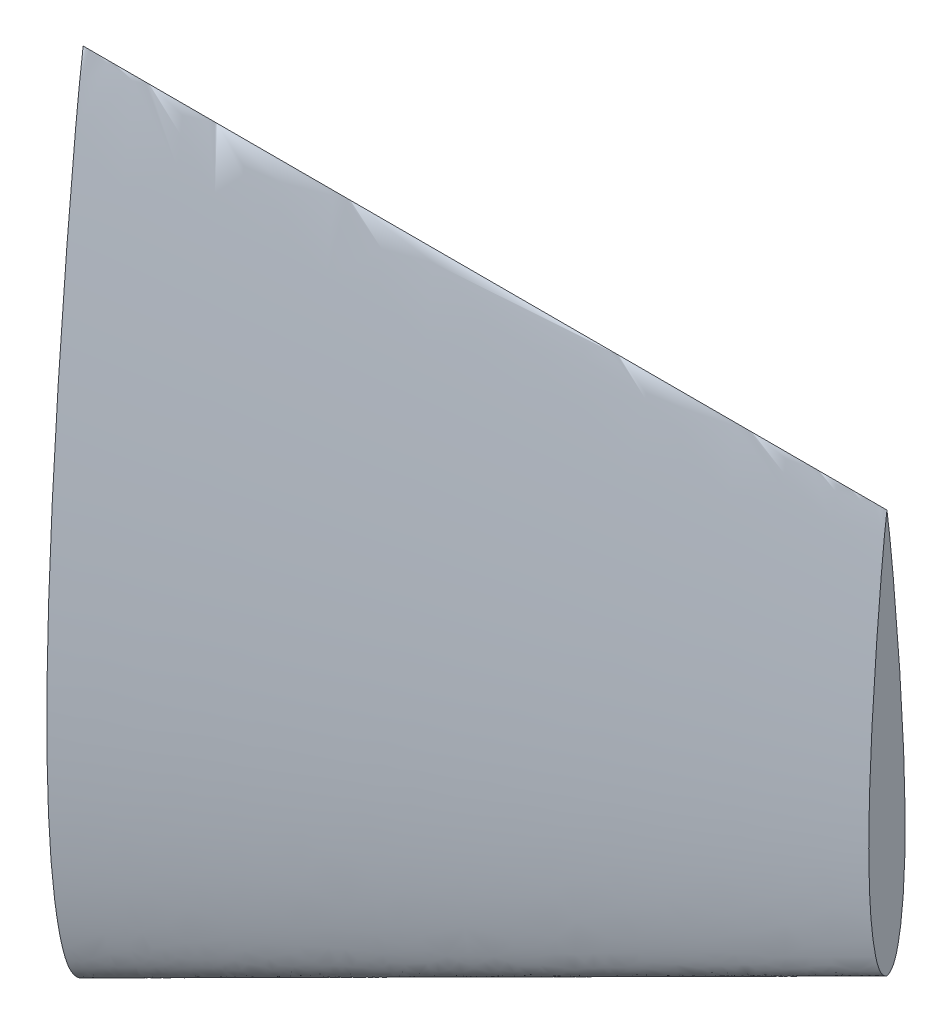
ISO-10303-21;
HEADER;
FILE_DESCRIPTION(('STEP AP214'),'2;1');
FILE_NAME('part.step','',(''),(''),'','','');
FILE_SCHEMA(('AUTOMOTIVE_DESIGN { 1 0 10303 214 1 1 1 1 }'));
ENDSEC;
DATA;
#1=APPLICATION_CONTEXT('core data for automotive mechanical design processes');
#2=APPLICATION_PROTOCOL_DEFINITION('international standard','automotive_design',2000,#1);
#3=PRODUCT_CONTEXT('',#1,'mechanical');
#4=PRODUCT('Part','Part','',(#3));
#5=PRODUCT_RELATED_PRODUCT_CATEGORY('part','',(#4));
#6=PRODUCT_DEFINITION_FORMATION('','',#4);
#7=PRODUCT_DEFINITION_CONTEXT('part definition',#1,'design');
#8=PRODUCT_DEFINITION('design','',#6,#7);
#9=PRODUCT_DEFINITION_SHAPE('','',#8);
#10=(LENGTH_UNIT() NAMED_UNIT(*) SI_UNIT(.MILLI.,.METRE.));
#11=(NAMED_UNIT(*) PLANE_ANGLE_UNIT() SI_UNIT($,.RADIAN.));
#12=(NAMED_UNIT(*) SI_UNIT($,.STERADIAN.) SOLID_ANGLE_UNIT());
#13=UNCERTAINTY_MEASURE_WITH_UNIT(LENGTH_MEASURE(1.E-05),#10,'distance_accuracy_value','');
#14=(GEOMETRIC_REPRESENTATION_CONTEXT(3) GLOBAL_UNCERTAINTY_ASSIGNED_CONTEXT((#13)) GLOBAL_UNIT_ASSIGNED_CONTEXT((#10,
#11,#12)) REPRESENTATION_CONTEXT('',''));
#15=CARTESIAN_POINT('',(0.,0.,0.));
#16=DIRECTION('',(0.,0.,1.));
#17=DIRECTION('',(1.,0.,0.));
#18=AXIS2_PLACEMENT_3D('',#15,#16,#17);
#19=CARTESIAN_POINT('',(57.,114.4,0.));
#20=CARTESIAN_POINT('',(0.,114.4,0.));
#21=CARTESIAN_POINT('',(57.,114.4,-0.00182095810749763));
#22=CARTESIAN_POINT('',(0.,114.4,-0.00364191621499526));
#23=CARTESIAN_POINT('',(57.,114.352907672617,-0.00546220916385912));
#24=CARTESIAN_POINT('',(0.,114.305815345234,-0.0109244183277182));
#25=CARTESIAN_POINT('',(57.,114.32002966172,-0.0109070616915182));
#26=CARTESIAN_POINT('',(0.,114.240059323441,-0.0218141233830365));
#27=CARTESIAN_POINT('',(57.,114.249222738711,-0.0198785714299646));
#28=CARTESIAN_POINT('',(0.,114.098445477423,-0.0397571428599293));
#29=CARTESIAN_POINT('',(57.,114.156548337744,-0.032132456041945));
#30=CARTESIAN_POINT('',(0.,113.913096675488,-0.0642649120838899));
#31=CARTESIAN_POINT('',(57.,114.034213823481,-0.0474417351200506));
#32=CARTESIAN_POINT('',(0.,113.668427646962,-0.0948834702401012));
#33=CARTESIAN_POINT('',(57.,113.886541749933,-0.0656072474393022));
#34=CARTESIAN_POINT('',(0.,113.373083499866,-0.131214494878604));
#35=CARTESIAN_POINT('',(57.,113.370012426993,-0.127548617429597));
#36=CARTESIAN_POINT('',(0.,112.340024853985,-0.255097234859193));
#37=CARTESIAN_POINT('',(57.,112.137163028017,-0.259027461460315));
#38=CARTESIAN_POINT('',(0.,109.874326056035,-0.51805492292063));
#39=CARTESIAN_POINT('',(57.,110.501004902275,-0.411740073326686));
#40=CARTESIAN_POINT('',(0.,106.60200980455,-0.823480146653373));
#41=CARTESIAN_POINT('',(57.,108.197187000479,-0.60964155845022));
#42=CARTESIAN_POINT('',(0.,101.994374000957,-1.21928311690044));
#43=CARTESIAN_POINT('',(57.,105.44956023543,-0.82314706743673));
#44=CARTESIAN_POINT('',(0.,96.4991204708607,-1.64629413487346));
#45=CARTESIAN_POINT('',(57.,101.925918142368,-1.05329602538316));
#46=CARTESIAN_POINT('',(0.,89.4518362847364,-2.10659205076633));
#47=CARTESIAN_POINT('',(57.0000000000001,98.2774944583724,-1.22854383866665));
#48=CARTESIAN_POINT('',(0.,82.1549889167448,-2.45708767733329));
#49=CARTESIAN_POINT('',(57.,95.5458702597783,-1.29200246249632));
#50=CARTESIAN_POINT('',(0.,76.6917405195566,-2.58400492499264));
#51=CARTESIAN_POINT('',(57.,93.7843198333664,-1.28990739427786));
#52=CARTESIAN_POINT('',(0.,73.1686396667328,-2.57981478855572));
#53=CARTESIAN_POINT('',(57.,92.7064529548784,-1.27556105945408));
#54=CARTESIAN_POINT('',(0.,71.0129059097568,-2.55112211890817));
#55=CARTESIAN_POINT('',(57.,91.4434168803456,-1.23757411909588));
#56=CARTESIAN_POINT('',(0.,68.4868337606911,-2.47514823819176));
#57=CARTESIAN_POINT('',(57.,89.8610871222189,-1.14403607707087));
#58=CARTESIAN_POINT('',(0.,65.3221742444376,-2.28807215414174));
#59=CARTESIAN_POINT('',(56.9999999999999,88.6339594379661,-1.01587816182833));
#60=CARTESIAN_POINT('',(0.,62.8679188759322,-2.03175632365666));
#61=CARTESIAN_POINT('',(57.,87.7322213407688,-0.870007471666012));
#62=CARTESIAN_POINT('',(0.,61.0644426815377,-1.74001494333202));
#63=CARTESIAN_POINT('',(57.,87.291174629283,-0.784346378199465));
#64=CARTESIAN_POINT('',(0.,60.1823492585658,-1.56869275639893));
#65=CARTESIAN_POINT('',(57.,86.9042703456185,-0.693141039222563));
#66=CARTESIAN_POINT('',(0.,59.4085406912369,-1.38628207844513));
#67=CARTESIAN_POINT('',(57.,86.5733208454091,-0.59333455424871));
#68=CARTESIAN_POINT('',(0.,58.746641690818,-1.18666910849742));
#69=CARTESIAN_POINT('',(57.,86.2785415535032,-0.4748173297146));
#70=CARTESIAN_POINT('',(0.,58.1570831070064,-0.9496346594292));
#71=CARTESIAN_POINT('',(57.,86.0648861911922,-0.349405025256917));
#72=CARTESIAN_POINT('',(0.,57.7297723823844,-0.698810050513834));
#73=CARTESIAN_POINT('',(57.,85.9154971726472,-0.217553009946631));
#74=CARTESIAN_POINT('',(0.,57.4309943452943,-0.435106019893263));
#75=CARTESIAN_POINT('',(57.,85.8398706402099,-0.125468872465283));
#76=CARTESIAN_POINT('',(0.,57.2797412804197,-0.250937744930566));
#77=CARTESIAN_POINT('',(57.,85.8046969145248,-0.0466468105661051));
#78=CARTESIAN_POINT('',(0.,57.2093938290495,-0.0932936211322103));
#79=CARTESIAN_POINT('',(57.,85.7984647875065,0.));
#80=CARTESIAN_POINT('',(0.,57.196929575013,0.));
#81=CARTESIAN_POINT('',(57.,85.8046969145248,0.0466468105660989));
#82=CARTESIAN_POINT('',(0.,57.2093938290495,0.0932936211321978));
#83=CARTESIAN_POINT('',(57.,85.8398706402099,0.125468872465298));
#84=CARTESIAN_POINT('',(0.,57.2797412804197,0.250937744930596));
#85=CARTESIAN_POINT('',(57.,85.9154971726472,0.217553009946615));
#86=CARTESIAN_POINT('',(0.,57.4309943452942,0.43510601989323));
#87=CARTESIAN_POINT('',(57.,86.0648861911922,0.349405025256929));
#88=CARTESIAN_POINT('',(0.,57.7297723823844,0.698810050513857));
#89=CARTESIAN_POINT('',(57.,86.2785415535032,0.474817329714599));
#90=CARTESIAN_POINT('',(0.,58.1570831070064,0.949634659429199));
#91=CARTESIAN_POINT('',(57.,86.5733208454091,0.593334554248706));
#92=CARTESIAN_POINT('',(0.,58.746641690818,1.18666910849741));
#93=CARTESIAN_POINT('',(57.,86.9042703456185,0.693141039222563));
#94=CARTESIAN_POINT('',(0.,59.4085406912369,1.38628207844513));
#95=CARTESIAN_POINT('',(57.,87.2911746292829,0.784346378199468));
#96=CARTESIAN_POINT('',(0.,60.1823492585659,1.56869275639894));
#97=CARTESIAN_POINT('',(57.,87.7322213407688,0.870007471666016));
#98=CARTESIAN_POINT('',(0.,61.0644426815377,1.74001494333203));
#99=CARTESIAN_POINT('',(57.,88.6339594379661,1.01587816182832));
#100=CARTESIAN_POINT('',(0.,62.867918875932,2.03175632365664));
#101=CARTESIAN_POINT('',(57.,89.8610871222189,1.14403607707087));
#102=CARTESIAN_POINT('',(0.,65.3221742444377,2.28807215414174));
#103=CARTESIAN_POINT('',(57.,91.4434168803456,1.23757411909588));
#104=CARTESIAN_POINT('',(0.,68.4868337606911,2.47514823819176));
#105=CARTESIAN_POINT('',(57.,92.7064529548784,1.27556105945408));
#106=CARTESIAN_POINT('',(0.,71.0129059097568,2.55112211890816));
#107=CARTESIAN_POINT('',(57.,93.7843198333664,1.28990739427786));
#108=CARTESIAN_POINT('',(0.,73.1686396667329,2.57981478855573));
#109=CARTESIAN_POINT('',(57.,95.5458702597782,1.29200246249631));
#110=CARTESIAN_POINT('',(0.,76.6917405195565,2.58400492499263));
#111=CARTESIAN_POINT('',(57.,98.2774944583724,1.22854383866664));
#112=CARTESIAN_POINT('',(0.,82.1549889167447,2.45708767733329));
#113=CARTESIAN_POINT('',(57.,101.925918142368,1.05329602538317));
#114=CARTESIAN_POINT('',(0.,89.4518362847363,2.10659205076633));
#115=CARTESIAN_POINT('',(57.,105.44956023543,0.823147067436728));
#116=CARTESIAN_POINT('',(0.,96.4991204708606,1.64629413487346));
#117=CARTESIAN_POINT('',(57.,108.197187000479,0.609641558450223));
#118=CARTESIAN_POINT('',(0.,101.994374000957,1.21928311690045));
#119=CARTESIAN_POINT('',(57.,110.501004902275,0.411740073326685));
#120=CARTESIAN_POINT('',(0.,106.60200980455,0.823480146653369));
#121=CARTESIAN_POINT('',(57.,112.137163028017,0.259027461460316));
#122=CARTESIAN_POINT('',(0.,109.874326056034,0.518054922920633));
#123=CARTESIAN_POINT('',(57.,113.370012426993,0.127548617429595));
#124=CARTESIAN_POINT('',(0.,112.340024853985,0.25509723485919));
#125=CARTESIAN_POINT('',(57.,113.886541749933,0.0656072474393026));
#126=CARTESIAN_POINT('',(0.,113.373083499866,0.131214494878605));
#127=CARTESIAN_POINT('',(57.,114.034213823481,0.0474417351200502));
#128=CARTESIAN_POINT('',(0.,113.668427646962,0.0948834702401005));
#129=CARTESIAN_POINT('',(57.,114.156548337744,0.0321324560419456));
#130=CARTESIAN_POINT('',(0.,113.913096675488,0.0642649120838911));
#131=CARTESIAN_POINT('',(57.,114.249222738711,0.0198785714299638));
#132=CARTESIAN_POINT('',(0.,114.098445477423,0.0397571428599277));
#133=CARTESIAN_POINT('',(57.,114.32002966172,0.0109070616915188));
#134=CARTESIAN_POINT('',(0.,114.240059323441,0.0218141233830376));
#135=CARTESIAN_POINT('',(57.,114.352907672617,0.00546220916385825));
#136=CARTESIAN_POINT('',(0.,114.305815345234,0.0109244183277165));
#137=CARTESIAN_POINT('',(57.,114.4,0.00182095810749828));
#138=CARTESIAN_POINT('',(0.,114.4,0.00364191621499655));
#139=CARTESIAN_POINT('',(57.,114.4,0.));
#140=CARTESIAN_POINT('',(0.,114.4,0.));
#141=B_SPLINE_SURFACE_WITH_KNOTS('',3,1,((#19,#20),(#21,#22),(#23,#24),(#25,#26),(#27,#28),(#29,
#30),(#31,#32),(#33,#34),(#35,#36),(#37,#38),(#39,#40),(#41,#42),(#43,#44),(#45,#46),(#47,#48),
(#49,#50),(#51,#52),(#53,#54),(#55,#56),(#57,#58),(#59,#60),(#61,#62),(#63,#64),(#65,#66),(#67,
#68),(#69,#70),(#71,#72),(#73,#74),(#75,#76),(#77,#78),(#79,#80),(#81,#82),(#83,#84),(#85,#86),
(#87,#88),(#89,#90),(#91,#92),(#93,#94),(#95,#96),(#97,#98),(#99,#100),(#101,#102),(#103,#104),
(#105,#106),(#107,#108),(#109,#110),(#111,#112),(#113,#114),(#115,#116),(#117,#118),(#119,#120),
(#121,#122),(#123,#124),(#125,#126),(#127,#128),(#129,#130),(#131,#132),(#133,#134),(#135,#136),
(#137,#138),(#139,#140)),.UNSPECIFIED.,.T.,.F.,.F.,(4,1,1,1,1,1,1,1,1,1,1,1,1,1,1,1,1,1,1,1,1,1,
1,1,1,1,1,1,1,1,1,1,1,1,1,1,1,1,1,1,1,1,1,1,1,1,1,1,1,1,1,1,1,1,1,1,1,1,4),(2,2),(0.,
0.000711185839145978,0.00142211189669672,0.00213325230730554,0.00425158120835245,
0.00636919832710714,0.00848752581630519,0.0119730784810976,0.0333165732602392,0.072750532853801,
0.0971333248630511,0.153150736130299,0.215572756141474,0.280129489501461,0.342436877180773,
0.35716003719228,0.371419982611637,0.398301185339692,0.422640862362832,0.453555830037826,
0.462206438132531,0.469975829256052,0.476836911130722,0.482800105251618,0.487877314409996,
0.493276037135274,0.495568649395588,0.498179926351265,0.499405098860122,0.5,0.500594901139878,
0.501820073648734,0.504431350604412,0.506723962864726,0.512122685590004,0.517199894748382,
0.523163088869278,0.530024170743948,0.537793561867469,0.546444169962174,0.577359137637168,
0.601698814660308,0.628580017388363,0.64283996280772,0.657563122819227,0.719870510498539,
0.784427243858526,0.846849263869701,0.902866675136949,0.927249467146199,0.966683426739761,
0.988026921518902,0.991512474183695,0.993630801672893,0.995748418791648,0.997866747692694,
0.998577888103303,0.999288814160854,1.),(0.,1.),.UNSPECIFIED.);
#142=CARTESIAN_POINT('',(57.,114.4,0.));
#143=CARTESIAN_POINT('',(57.,114.4,-0.00182095810749763));
#144=CARTESIAN_POINT('',(57.,114.352907672617,-0.00546220916385912));
#145=CARTESIAN_POINT('',(57.,114.32002966172,-0.0109070616915182));
#146=CARTESIAN_POINT('',(57.,114.249222738711,-0.0198785714299646));
#147=CARTESIAN_POINT('',(57.,114.156548337744,-0.032132456041945));
#148=CARTESIAN_POINT('',(57.,114.034213823481,-0.0474417351200506));
#149=CARTESIAN_POINT('',(57.,113.886541749933,-0.0656072474393022));
#150=CARTESIAN_POINT('',(57.,113.370012426993,-0.127548617429597));
#151=CARTESIAN_POINT('',(57.,112.137163028017,-0.259027461460315));
#152=CARTESIAN_POINT('',(57.,110.501004902275,-0.411740073326686));
#153=CARTESIAN_POINT('',(57.,108.197187000479,-0.60964155845022));
#154=CARTESIAN_POINT('',(57.,105.44956023543,-0.82314706743673));
#155=CARTESIAN_POINT('',(57.,101.925918142368,-1.05329602538316));
#156=CARTESIAN_POINT('',(57.0000000000001,98.2774944583724,-1.22854383866665));
#157=CARTESIAN_POINT('',(57.,95.5458702597783,-1.29200246249632));
#158=CARTESIAN_POINT('',(57.,93.7843198333664,-1.28990739427786));
#159=CARTESIAN_POINT('',(57.,92.7064529548784,-1.27556105945408));
#160=CARTESIAN_POINT('',(57.,91.4434168803456,-1.23757411909588));
#161=CARTESIAN_POINT('',(57.,89.8610871222189,-1.14403607707087));
#162=CARTESIAN_POINT('',(56.9999999999999,88.6339594379661,-1.01587816182833));
#163=CARTESIAN_POINT('',(57.,87.7322213407688,-0.870007471666012));
#164=CARTESIAN_POINT('',(57.,87.291174629283,-0.784346378199465));
#165=CARTESIAN_POINT('',(57.,86.9042703456185,-0.693141039222563));
#166=CARTESIAN_POINT('',(57.,86.5733208454091,-0.59333455424871));
#167=CARTESIAN_POINT('',(57.,86.2785415535032,-0.4748173297146));
#168=CARTESIAN_POINT('',(57.,86.0648861911922,-0.349405025256917));
#169=CARTESIAN_POINT('',(57.,85.9154971726472,-0.217553009946631));
#170=CARTESIAN_POINT('',(57.,85.8398706402099,-0.125468872465283));
#171=CARTESIAN_POINT('',(57.,85.8046969145248,-0.0466468105661051));
#172=CARTESIAN_POINT('',(57.,85.7984647875065,0.));
#173=CARTESIAN_POINT('',(57.,85.8046969145248,0.0466468105660989));
#174=CARTESIAN_POINT('',(57.,85.8398706402099,0.125468872465298));
#175=CARTESIAN_POINT('',(57.,85.9154971726472,0.217553009946615));
#176=CARTESIAN_POINT('',(57.,86.0648861911922,0.349405025256929));
#177=CARTESIAN_POINT('',(57.,86.2785415535032,0.474817329714599));
#178=CARTESIAN_POINT('',(57.,86.5733208454091,0.593334554248706));
#179=CARTESIAN_POINT('',(57.,86.9042703456185,0.693141039222563));
#180=CARTESIAN_POINT('',(57.,87.2911746292829,0.784346378199468));
#181=CARTESIAN_POINT('',(57.,87.7322213407688,0.870007471666016));
#182=CARTESIAN_POINT('',(57.,88.6339594379661,1.01587816182832));
#183=CARTESIAN_POINT('',(57.,89.8610871222189,1.14403607707087));
#184=CARTESIAN_POINT('',(57.,91.4434168803456,1.23757411909588));
#185=CARTESIAN_POINT('',(57.,92.7064529548784,1.27556105945408));
#186=CARTESIAN_POINT('',(57.,93.7843198333664,1.28990739427786));
#187=CARTESIAN_POINT('',(57.,95.5458702597782,1.29200246249631));
#188=CARTESIAN_POINT('',(57.,98.2774944583724,1.22854383866664));
#189=CARTESIAN_POINT('',(57.,101.925918142368,1.05329602538317));
#190=CARTESIAN_POINT('',(57.,105.44956023543,0.823147067436728));
#191=CARTESIAN_POINT('',(57.,108.197187000479,0.609641558450223));
#192=CARTESIAN_POINT('',(57.,110.501004902275,0.411740073326685));
#193=CARTESIAN_POINT('',(57.,112.137163028017,0.259027461460316));
#194=CARTESIAN_POINT('',(57.,113.370012426993,0.127548617429595));
#195=CARTESIAN_POINT('',(57.,113.886541749933,0.0656072474393026));
#196=CARTESIAN_POINT('',(57.,114.034213823481,0.0474417351200502));
#197=CARTESIAN_POINT('',(57.,114.156548337744,0.0321324560419456));
#198=CARTESIAN_POINT('',(57.,114.249222738711,0.0198785714299638));
#199=CARTESIAN_POINT('',(57.,114.32002966172,0.0109070616915188));
#200=CARTESIAN_POINT('',(57.,114.352907672617,0.00546220916385825));
#201=CARTESIAN_POINT('',(57.,114.4,0.00182095810749828));
#202=CARTESIAN_POINT('',(57.,114.4,0.));
#203=B_SPLINE_CURVE_WITH_KNOTS('',3,(#142,#143,#144,#145,#146,#147,#148,#149,#150,#151,#152,
#153,#154,#155,#156,#157,#158,#159,#160,#161,#162,#163,#164,#165,#166,#167,#168,#169,#170,#171,
#172,#173,#174,#175,#176,#177,#178,#179,#180,#181,#182,#183,#184,#185,#186,#187,#188,#189,#190,
#191,#192,#193,#194,#195,#196,#197,#198,#199,#200,#201,#202),.UNSPECIFIED.,.T.,.F.,(4,1,1,1,1,1,
1,1,1,1,1,1,1,1,1,1,1,1,1,1,1,1,1,1,1,1,1,1,1,1,1,1,1,1,1,1,1,1,1,1,1,1,1,1,1,1,1,1,1,1,1,1,1,1,
1,1,1,1,4),(0.,0.000711185839145978,0.00142211189669672,0.00213325230730554,0.00425158120835245,
0.00636919832710714,0.00848752581630519,0.0119730784810976,0.0333165732602392,0.072750532853801,
0.0971333248630511,0.153150736130299,0.215572756141474,0.280129489501461,0.342436877180773,
0.35716003719228,0.371419982611637,0.398301185339692,0.422640862362832,0.453555830037826,
0.462206438132531,0.469975829256052,0.476836911130722,0.482800105251618,0.487877314409996,
0.493276037135274,0.495568649395588,0.498179926351265,0.499405098860122,0.5,0.500594901139878,
0.501820073648734,0.504431350604412,0.506723962864726,0.512122685590004,0.517199894748382,
0.523163088869278,0.530024170743948,0.537793561867469,0.546444169962174,0.577359137637168,
0.601698814660308,0.628580017388363,0.64283996280772,0.657563122819227,0.719870510498539,
0.784427243858526,0.846849263869701,0.902866675136949,0.927249467146199,0.966683426739761,
0.988026921518902,0.991512474183695,0.993630801672893,0.995748418791648,0.997866747692694,
0.998577888103303,0.999288814160854,1.),.UNSPECIFIED.);
#204=CARTESIAN_POINT('',(57.,114.4,0.));
#205=VERTEX_POINT('',#204);
#206=EDGE_CURVE('E11',#205,#205,#203,.T.);
#207=CARTESIAN_POINT('',(0.,114.4,0.));
#208=CARTESIAN_POINT('',(0.,114.4,-0.00364191621499526));
#209=CARTESIAN_POINT('',(0.,114.305815345234,-0.0109244183277182));
#210=CARTESIAN_POINT('',(0.,114.240059323441,-0.0218141233830365));
#211=CARTESIAN_POINT('',(0.,114.098445477423,-0.0397571428599293));
#212=CARTESIAN_POINT('',(0.,113.913096675488,-0.0642649120838899));
#213=CARTESIAN_POINT('',(0.,113.668427646962,-0.0948834702401012));
#214=CARTESIAN_POINT('',(0.,113.373083499866,-0.131214494878604));
#215=CARTESIAN_POINT('',(0.,112.340024853985,-0.255097234859193));
#216=CARTESIAN_POINT('',(0.,109.874326056035,-0.51805492292063));
#217=CARTESIAN_POINT('',(0.,106.60200980455,-0.823480146653373));
#218=CARTESIAN_POINT('',(0.,101.994374000957,-1.21928311690044));
#219=CARTESIAN_POINT('',(0.,96.4991204708607,-1.64629413487346));
#220=CARTESIAN_POINT('',(0.,89.4518362847364,-2.10659205076633));
#221=CARTESIAN_POINT('',(0.,82.1549889167448,-2.45708767733329));
#222=CARTESIAN_POINT('',(0.,76.6917405195566,-2.58400492499264));
#223=CARTESIAN_POINT('',(0.,73.1686396667328,-2.57981478855572));
#224=CARTESIAN_POINT('',(0.,71.0129059097568,-2.55112211890817));
#225=CARTESIAN_POINT('',(0.,68.4868337606911,-2.47514823819176));
#226=CARTESIAN_POINT('',(0.,65.3221742444376,-2.28807215414174));
#227=CARTESIAN_POINT('',(0.,62.8679188759322,-2.03175632365666));
#228=CARTESIAN_POINT('',(0.,61.0644426815377,-1.74001494333202));
#229=CARTESIAN_POINT('',(0.,60.1823492585658,-1.56869275639893));
#230=CARTESIAN_POINT('',(0.,59.4085406912369,-1.38628207844513));
#231=CARTESIAN_POINT('',(0.,58.746641690818,-1.18666910849742));
#232=CARTESIAN_POINT('',(0.,58.1570831070064,-0.9496346594292));
#233=CARTESIAN_POINT('',(0.,57.7297723823844,-0.698810050513834));
#234=CARTESIAN_POINT('',(0.,57.4309943452943,-0.435106019893263));
#235=CARTESIAN_POINT('',(0.,57.2797412804197,-0.250937744930566));
#236=CARTESIAN_POINT('',(0.,57.2093938290495,-0.0932936211322103));
#237=CARTESIAN_POINT('',(0.,57.196929575013,0.));
#238=CARTESIAN_POINT('',(0.,57.2093938290495,0.0932936211321978));
#239=CARTESIAN_POINT('',(0.,57.2797412804197,0.250937744930596));
#240=CARTESIAN_POINT('',(0.,57.4309943452942,0.43510601989323));
#241=CARTESIAN_POINT('',(0.,57.7297723823844,0.698810050513857));
#242=CARTESIAN_POINT('',(0.,58.1570831070064,0.949634659429199));
#243=CARTESIAN_POINT('',(0.,58.746641690818,1.18666910849741));
#244=CARTESIAN_POINT('',(0.,59.4085406912369,1.38628207844513));
#245=CARTESIAN_POINT('',(0.,60.1823492585659,1.56869275639894));
#246=CARTESIAN_POINT('',(0.,61.0644426815377,1.74001494333203));
#247=CARTESIAN_POINT('',(0.,62.867918875932,2.03175632365664));
#248=CARTESIAN_POINT('',(0.,65.3221742444377,2.28807215414174));
#249=CARTESIAN_POINT('',(0.,68.4868337606911,2.47514823819176));
#250=CARTESIAN_POINT('',(0.,71.0129059097568,2.55112211890816));
#251=CARTESIAN_POINT('',(0.,73.1686396667329,2.57981478855573));
#252=CARTESIAN_POINT('',(0.,76.6917405195565,2.58400492499263));
#253=CARTESIAN_POINT('',(0.,82.1549889167447,2.45708767733329));
#254=CARTESIAN_POINT('',(0.,89.4518362847363,2.10659205076633));
#255=CARTESIAN_POINT('',(0.,96.4991204708606,1.64629413487346));
#256=CARTESIAN_POINT('',(0.,101.994374000957,1.21928311690045));
#257=CARTESIAN_POINT('',(0.,106.60200980455,0.823480146653369));
#258=CARTESIAN_POINT('',(0.,109.874326056034,0.518054922920633));
#259=CARTESIAN_POINT('',(0.,112.340024853985,0.25509723485919));
#260=CARTESIAN_POINT('',(0.,113.373083499866,0.131214494878605));
#261=CARTESIAN_POINT('',(0.,113.668427646962,0.0948834702401005));
#262=CARTESIAN_POINT('',(0.,113.913096675488,0.0642649120838911));
#263=CARTESIAN_POINT('',(0.,114.098445477423,0.0397571428599277));
#264=CARTESIAN_POINT('',(0.,114.240059323441,0.0218141233830376));
#265=CARTESIAN_POINT('',(0.,114.305815345234,0.0109244183277165));
#266=CARTESIAN_POINT('',(0.,114.4,0.00364191621499655));
#267=CARTESIAN_POINT('',(0.,114.4,0.));
#268=B_SPLINE_CURVE_WITH_KNOTS('',3,(#207,#208,#209,#210,#211,#212,#213,#214,#215,#216,#217,
#218,#219,#220,#221,#222,#223,#224,#225,#226,#227,#228,#229,#230,#231,#232,#233,#234,#235,#236,
#237,#238,#239,#240,#241,#242,#243,#244,#245,#246,#247,#248,#249,#250,#251,#252,#253,#254,#255,
#256,#257,#258,#259,#260,#261,#262,#263,#264,#265,#266,#267),.UNSPECIFIED.,.T.,.F.,(4,1,1,1,1,1,
1,1,1,1,1,1,1,1,1,1,1,1,1,1,1,1,1,1,1,1,1,1,1,1,1,1,1,1,1,1,1,1,1,1,1,1,1,1,1,1,1,1,1,1,1,1,1,1,
1,1,1,1,4),(0.,0.000711185839145978,0.00142211189669672,0.00213325230730554,0.00425158120835245,
0.00636919832710714,0.00848752581630519,0.0119730784810976,0.0333165732602392,0.072750532853801,
0.0971333248630511,0.153150736130299,0.215572756141474,0.280129489501461,0.342436877180773,
0.35716003719228,0.371419982611637,0.398301185339692,0.422640862362832,0.453555830037826,
0.462206438132531,0.469975829256052,0.476836911130722,0.482800105251618,0.487877314409996,
0.493276037135274,0.495568649395588,0.498179926351265,0.499405098860122,0.5,0.500594901139878,
0.501820073648734,0.504431350604412,0.506723962864726,0.512122685590004,0.517199894748382,
0.523163088869278,0.530024170743948,0.537793561867469,0.546444169962174,0.577359137637168,
0.601698814660308,0.628580017388363,0.64283996280772,0.657563122819227,0.719870510498539,
0.784427243858526,0.846849263869701,0.902866675136949,0.927249467146199,0.966683426739761,
0.988026921518902,0.991512474183695,0.993630801672893,0.995748418791648,0.997866747692694,
0.998577888103303,0.999288814160854,1.),.UNSPECIFIED.);
#269=CARTESIAN_POINT('',(0.,114.4,0.));
#270=VERTEX_POINT('',#269);
#271=EDGE_CURVE('E57',#270,#270,#268,.T.);
#272=ORIENTED_EDGE('',*,*,#206,.T.);
#273=EDGE_LOOP('',(#272));
#274=FACE_BOUND('',#273,.T.);
#275=ORIENTED_EDGE('',*,*,#271,.F.);
#276=EDGE_LOOP('',(#275));
#277=FACE_BOUND('',#276,.T.);
#278=ADVANCED_FACE('F53',(#274,#277),#141,.T.);
#279=CARTESIAN_POINT('',(57.,85.8,0.));
#280=DIRECTION('',(1.,0.,0.));
#281=DIRECTION('',(0.,0.,-1.));
#282=AXIS2_PLACEMENT_3D('',#279,#280,#281);
#283=PLANE('',#282);
#284=ORIENTED_EDGE('',*,*,#206,.F.);
#285=EDGE_LOOP('',(#284));
#286=FACE_BOUND('',#285,.T.);
#287=ADVANCED_FACE('F77',(#286),#283,.T.);
#288=CARTESIAN_POINT('',(0.,57.2,0.));
#289=DIRECTION('',(1.,0.,0.));
#290=DIRECTION('',(0.,0.,-1.));
#291=AXIS2_PLACEMENT_3D('',#288,#289,#290);
#292=PLANE('',#291);
#293=ORIENTED_EDGE('',*,*,#271,.T.);
#294=EDGE_LOOP('',(#293));
#295=FACE_BOUND('',#294,.T.);
#296=ADVANCED_FACE('F55',(#295),#292,.F.);
#297=CLOSED_SHELL('',(#278,#287,#296));
#298=MANIFOLD_SOLID_BREP('B2',#297);
#299=ADVANCED_BREP_SHAPE_REPRESENTATION('',(#18,#298),#14);
#300=SHAPE_DEFINITION_REPRESENTATION(#9,#299);
ENDSEC;
END-ISO-10303-21;
